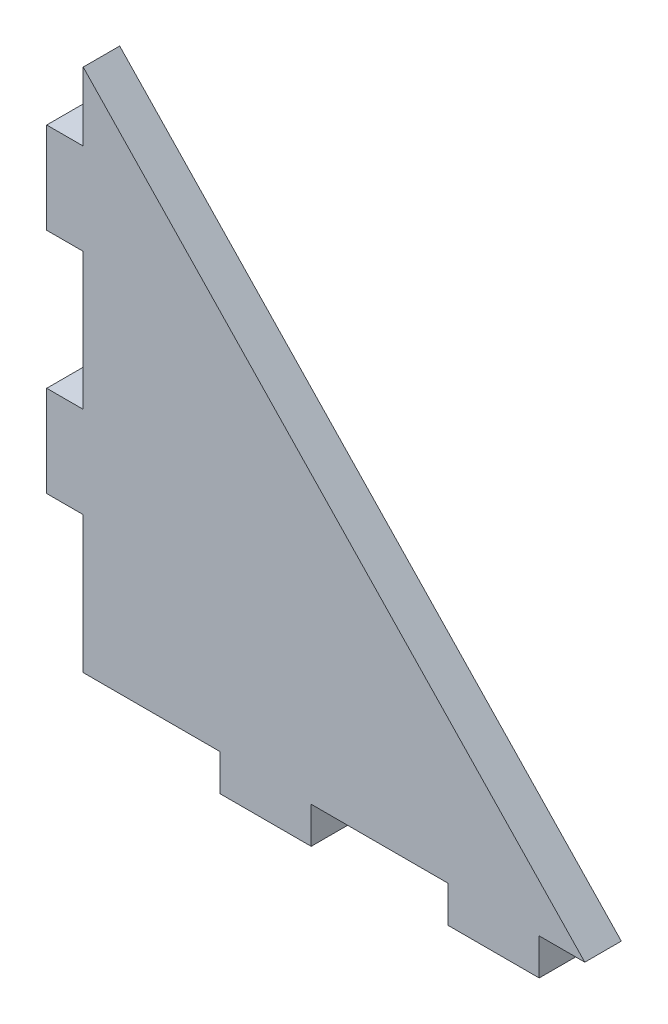
ISO-10303-21;
HEADER;
FILE_DESCRIPTION(('STEP AP214'),'2;1');
FILE_NAME('part.step','',(''),(''),'','','');
FILE_SCHEMA(('AUTOMOTIVE_DESIGN { 1 0 10303 214 1 1 1 1 }'));
ENDSEC;
DATA;
#1=APPLICATION_CONTEXT('core data for automotive mechanical design processes');
#2=APPLICATION_PROTOCOL_DEFINITION('international standard','automotive_design',2000,#1);
#3=PRODUCT_CONTEXT('',#1,'mechanical');
#4=PRODUCT('Part','Part','',(#3));
#5=PRODUCT_RELATED_PRODUCT_CATEGORY('part','',(#4));
#6=PRODUCT_DEFINITION_FORMATION('','',#4);
#7=PRODUCT_DEFINITION_CONTEXT('part definition',#1,'design');
#8=PRODUCT_DEFINITION('design','',#6,#7);
#9=PRODUCT_DEFINITION_SHAPE('','',#8);
#10=(LENGTH_UNIT() NAMED_UNIT(*) SI_UNIT(.MILLI.,.METRE.));
#11=(NAMED_UNIT(*) PLANE_ANGLE_UNIT() SI_UNIT($,.RADIAN.));
#12=(NAMED_UNIT(*) SI_UNIT($,.STERADIAN.) SOLID_ANGLE_UNIT());
#13=UNCERTAINTY_MEASURE_WITH_UNIT(LENGTH_MEASURE(1.E-05),#10,'distance_accuracy_value','');
#14=(GEOMETRIC_REPRESENTATION_CONTEXT(3) GLOBAL_UNCERTAINTY_ASSIGNED_CONTEXT((#13)) GLOBAL_UNIT_ASSIGNED_CONTEXT((#10,
#11,#12)) REPRESENTATION_CONTEXT('',''));
#15=CARTESIAN_POINT('',(0.,0.,0.));
#16=DIRECTION('',(0.,0.,1.));
#17=DIRECTION('',(1.,0.,0.));
#18=AXIS2_PLACEMENT_3D('',#15,#16,#17);
#19=CARTESIAN_POINT('',(0.,0.,8.));
#20=DIRECTION('',(0.,1.,0.));
#21=DIRECTION('',(0.,0.,1.));
#22=AXIS2_PLACEMENT_3D('',#19,#20,#21);
#23=PLANE('',#22);
#24=DIRECTION('',(0.,0.,-1.));
#25=VECTOR('',#24,1.);
#26=CARTESIAN_POINT('',(80.,0.,8.));
#27=LINE('',#26,#25);
#28=CARTESIAN_POINT('',(80.,0.,8.));
#29=VERTEX_POINT('',#28);
#30=CARTESIAN_POINT('',(80.,0.,0.));
#31=VERTEX_POINT('',#30);
#32=EDGE_CURVE('E56',#29,#31,#27,.T.);
#33=ORIENTED_EDGE('',*,*,#32,.F.);
#34=DIRECTION('',(1.,0.,0.));
#35=VECTOR('',#34,1.);
#36=CARTESIAN_POINT('',(0.,0.,8.));
#37=LINE('',#36,#35);
#38=CARTESIAN_POINT('',(50.,0.,8.));
#39=VERTEX_POINT('',#38);
#40=EDGE_CURVE('E172',#39,#29,#37,.T.);
#41=ORIENTED_EDGE('',*,*,#40,.F.);
#42=DIRECTION('',(0.,0.,-1.));
#43=VECTOR('',#42,1.);
#44=CARTESIAN_POINT('',(50.,0.,8.));
#45=LINE('',#44,#43);
#46=CARTESIAN_POINT('',(50.,0.,0.));
#47=VERTEX_POINT('',#46);
#48=EDGE_CURVE('E217',#39,#47,#45,.T.);
#49=ORIENTED_EDGE('',*,*,#48,.T.);
#50=DIRECTION('',(1.,0.,0.));
#51=VECTOR('',#50,1.);
#52=CARTESIAN_POINT('',(0.,0.,0.));
#53=LINE('',#52,#51);
#54=EDGE_CURVE('E295',#47,#31,#53,.T.);
#55=ORIENTED_EDGE('',*,*,#54,.T.);
#56=EDGE_LOOP('',(#33,#41,#49,#55));
#57=FACE_BOUND('',#56,.T.);
#58=ADVANCED_FACE('F33',(#57),#23,.F.);
#59=DIRECTION('',(0.,0.,-1.));
#60=VECTOR('',#59,1.);
#61=CARTESIAN_POINT('',(100.,0.,8.));
#62=LINE('',#61,#60);
#63=CARTESIAN_POINT('',(100.,0.,8.));
#64=VERTEX_POINT('',#63);
#65=CARTESIAN_POINT('',(100.,0.,0.));
#66=VERTEX_POINT('',#65);
#67=EDGE_CURVE('E190',#64,#66,#62,.T.);
#68=ORIENTED_EDGE('',*,*,#67,.T.);
#69=CARTESIAN_POINT('',(110.,0.,0.));
#70=VERTEX_POINT('',#69);
#71=EDGE_CURVE('E289',#66,#70,#53,.T.);
#72=ORIENTED_EDGE('',*,*,#71,.T.);
#73=DIRECTION('',(0.,0.,-1.));
#74=VECTOR('',#73,1.);
#75=CARTESIAN_POINT('',(110.,0.,8.));
#76=LINE('',#75,#74);
#77=CARTESIAN_POINT('',(110.,0.,8.));
#78=VERTEX_POINT('',#77);
#79=EDGE_CURVE('E41',#78,#70,#76,.T.);
#80=ORIENTED_EDGE('',*,*,#79,.F.);
#81=EDGE_CURVE('E48',#64,#78,#37,.T.);
#82=ORIENTED_EDGE('',*,*,#81,.F.);
#83=EDGE_LOOP('',(#68,#72,#80,#82));
#84=FACE_BOUND('',#83,.T.);
#85=ADVANCED_FACE('F322',(#84),#23,.F.);
#86=DIRECTION('',(0.,0.,-1.));
#87=VECTOR('',#86,1.);
#88=CARTESIAN_POINT('',(30.,0.,8.));
#89=LINE('',#88,#87);
#90=CARTESIAN_POINT('',(30.,0.,8.));
#91=VERTEX_POINT('',#90);
#92=CARTESIAN_POINT('',(30.,0.,0.));
#93=VERTEX_POINT('',#92);
#94=EDGE_CURVE('E210',#91,#93,#89,.T.);
#95=ORIENTED_EDGE('',*,*,#94,.F.);
#96=CARTESIAN_POINT('',(0.,0.,8.));
#97=VERTEX_POINT('',#96);
#98=EDGE_CURVE('E281',#97,#91,#37,.T.);
#99=ORIENTED_EDGE('',*,*,#98,.F.);
#100=DIRECTION('',(0.,0.,-1.));
#101=VECTOR('',#100,1.);
#102=CARTESIAN_POINT('',(0.,0.,8.));
#103=LINE('',#102,#101);
#104=CARTESIAN_POINT('',(0.,0.,0.));
#105=VERTEX_POINT('',#104);
#106=EDGE_CURVE('E11',#97,#105,#103,.T.);
#107=ORIENTED_EDGE('',*,*,#106,.T.);
#108=EDGE_CURVE('E291',#105,#93,#53,.T.);
#109=ORIENTED_EDGE('',*,*,#108,.T.);
#110=EDGE_LOOP('',(#95,#99,#107,#109));
#111=FACE_BOUND('',#110,.T.);
#112=ADVANCED_FACE('F340',(#111),#23,.F.);
#113=CARTESIAN_POINT('',(0.,0.,8.));
#114=DIRECTION('',(1.,0.,0.));
#115=DIRECTION('',(0.,0.,-1.));
#116=AXIS2_PLACEMENT_3D('',#113,#114,#115);
#117=PLANE('',#116);
#118=DIRECTION('',(0.,0.,-1.));
#119=VECTOR('',#118,1.);
#120=CARTESIAN_POINT('',(0.,80.,8.));
#121=LINE('',#120,#119);
#122=CARTESIAN_POINT('',(0.,80.,8.));
#123=VERTEX_POINT('',#122);
#124=CARTESIAN_POINT('',(0.,80.,0.));
#125=VERTEX_POINT('',#124);
#126=EDGE_CURVE('E249',#123,#125,#121,.T.);
#127=ORIENTED_EDGE('',*,*,#126,.T.);
#128=DIRECTION('',(0.,-1.,0.));
#129=VECTOR('',#128,1.);
#130=CARTESIAN_POINT('',(0.,0.,0.));
#131=LINE('',#130,#129);
#132=CARTESIAN_POINT('',(0.,50.,0.));
#133=VERTEX_POINT('',#132);
#134=EDGE_CURVE('E290',#125,#133,#131,.T.);
#135=ORIENTED_EDGE('',*,*,#134,.T.);
#136=DIRECTION('',(0.,0.,-1.));
#137=VECTOR('',#136,1.);
#138=CARTESIAN_POINT('',(0.,50.,8.));
#139=LINE('',#138,#137);
#140=CARTESIAN_POINT('',(0.,50.,8.));
#141=VERTEX_POINT('',#140);
#142=EDGE_CURVE('E273',#141,#133,#139,.T.);
#143=ORIENTED_EDGE('',*,*,#142,.F.);
#144=DIRECTION('',(0.,-1.,0.));
#145=VECTOR('',#144,1.);
#146=CARTESIAN_POINT('',(0.,0.,8.));
#147=LINE('',#146,#145);
#148=EDGE_CURVE('E279',#123,#141,#147,.T.);
#149=ORIENTED_EDGE('',*,*,#148,.F.);
#150=EDGE_LOOP('',(#127,#135,#143,#149));
#151=FACE_BOUND('',#150,.T.);
#152=ADVANCED_FACE('F350',(#151),#117,.F.);
#153=DIRECTION('',(0.,0.,-1.));
#154=VECTOR('',#153,1.);
#155=CARTESIAN_POINT('',(0.,100.,8.));
#156=LINE('',#155,#154);
#157=CARTESIAN_POINT('',(0.,100.,8.));
#158=VERTEX_POINT('',#157);
#159=CARTESIAN_POINT('',(0.,100.,0.));
#160=VERTEX_POINT('',#159);
#161=EDGE_CURVE('E246',#158,#160,#156,.T.);
#162=ORIENTED_EDGE('',*,*,#161,.F.);
#163=CARTESIAN_POINT('',(0.,115.,8.));
#164=VERTEX_POINT('',#163);
#165=EDGE_CURVE('E277',#164,#158,#147,.T.);
#166=ORIENTED_EDGE('',*,*,#165,.F.);
#167=DIRECTION('',(0.,0.,-1.));
#168=VECTOR('',#167,1.);
#169=CARTESIAN_POINT('',(0.,115.,8.));
#170=LINE('',#169,#168);
#171=CARTESIAN_POINT('',(0.,115.,0.));
#172=VERTEX_POINT('',#171);
#173=EDGE_CURVE('E286',#164,#172,#170,.T.);
#174=ORIENTED_EDGE('',*,*,#173,.T.);
#175=EDGE_CURVE('E287',#172,#160,#131,.T.);
#176=ORIENTED_EDGE('',*,*,#175,.T.);
#177=EDGE_LOOP('',(#162,#166,#174,#176));
#178=FACE_BOUND('',#177,.T.);
#179=ADVANCED_FACE('F311',(#178),#117,.F.);
#180=CARTESIAN_POINT('',(0.,30.,8.));
#181=VERTEX_POINT('',#180);
#182=EDGE_CURVE('E280',#181,#97,#147,.T.);
#183=ORIENTED_EDGE('',*,*,#182,.F.);
#184=DIRECTION('',(0.,0.,-1.));
#185=VECTOR('',#184,1.);
#186=CARTESIAN_POINT('',(0.,30.,8.));
#187=LINE('',#186,#185);
#188=CARTESIAN_POINT('',(0.,30.,0.));
#189=VERTEX_POINT('',#188);
#190=EDGE_CURVE('E260',#181,#189,#187,.T.);
#191=ORIENTED_EDGE('',*,*,#190,.T.);
#192=EDGE_CURVE('E276',#189,#105,#131,.T.);
#193=ORIENTED_EDGE('',*,*,#192,.T.);
#194=ORIENTED_EDGE('',*,*,#106,.F.);
#195=EDGE_LOOP('',(#183,#191,#193,#194));
#196=FACE_BOUND('',#195,.T.);
#197=ADVANCED_FACE('F35',(#196),#117,.F.);
#198=CARTESIAN_POINT('',(0.,115.,8.));
#199=DIRECTION('',(-0.722641857147699,-0.691222645967364,0.));
#200=DIRECTION('',(0.691222645967364,-0.722641857147699,0.));
#201=AXIS2_PLACEMENT_3D('',#198,#199,#200);
#202=PLANE('',#201);
#203=DIRECTION('',(-0.691222645967364,0.722641857147699,0.));
#204=VECTOR('',#203,1.);
#205=CARTESIAN_POINT('',(0.,115.,0.));
#206=LINE('',#205,#204);
#207=EDGE_CURVE('E294',#70,#172,#206,.T.);
#208=ORIENTED_EDGE('',*,*,#207,.T.);
#209=ORIENTED_EDGE('',*,*,#173,.F.);
#210=DIRECTION('',(-0.691222645967364,0.722641857147699,0.));
#211=VECTOR('',#210,1.);
#212=CARTESIAN_POINT('',(0.,115.,8.));
#213=LINE('',#212,#211);
#214=EDGE_CURVE('E284',#78,#164,#213,.T.);
#215=ORIENTED_EDGE('',*,*,#214,.F.);
#216=ORIENTED_EDGE('',*,*,#79,.T.);
#217=EDGE_LOOP('',(#208,#209,#215,#216));
#218=FACE_BOUND('',#217,.T.);
#219=ADVANCED_FACE('F302',(#218),#202,.F.);
#220=CARTESIAN_POINT('',(0.,0.,8.));
#221=DIRECTION('',(0.,0.,-1.));
#222=DIRECTION('',(-1.,0.,0.));
#223=AXIS2_PLACEMENT_3D('',#220,#221,#222);
#224=PLANE('',#223);
#225=ORIENTED_EDGE('',*,*,#165,.T.);
#226=DIRECTION('',(-1.,0.,0.));
#227=VECTOR('',#226,1.);
#228=CARTESIAN_POINT('',(0.,100.,8.));
#229=LINE('',#228,#227);
#230=CARTESIAN_POINT('',(-8.,100.,8.));
#231=VERTEX_POINT('',#230);
#232=EDGE_CURVE('E230',#158,#231,#229,.T.);
#233=ORIENTED_EDGE('',*,*,#232,.T.);
#234=DIRECTION('',(0.,-1.,0.));
#235=VECTOR('',#234,1.);
#236=CARTESIAN_POINT('',(-8.,80.,8.));
#237=LINE('',#236,#235);
#238=CARTESIAN_POINT('',(-8.,80.,8.));
#239=VERTEX_POINT('',#238);
#240=EDGE_CURVE('E233',#231,#239,#237,.T.);
#241=ORIENTED_EDGE('',*,*,#240,.T.);
#242=DIRECTION('',(1.,0.,0.));
#243=VECTOR('',#242,1.);
#244=CARTESIAN_POINT('',(0.,80.,8.));
#245=LINE('',#244,#243);
#246=EDGE_CURVE('E227',#239,#123,#245,.T.);
#247=ORIENTED_EDGE('',*,*,#246,.T.);
#248=ORIENTED_EDGE('',*,*,#148,.T.);
#249=DIRECTION('',(-1.,0.,0.));
#250=VECTOR('',#249,1.);
#251=CARTESIAN_POINT('',(0.,50.,8.));
#252=LINE('',#251,#250);
#253=CARTESIAN_POINT('',(-8.,50.,8.));
#254=VERTEX_POINT('',#253);
#255=EDGE_CURVE('E253',#141,#254,#252,.T.);
#256=ORIENTED_EDGE('',*,*,#255,.T.);
#257=DIRECTION('',(0.,-1.,0.));
#258=VECTOR('',#257,1.);
#259=CARTESIAN_POINT('',(-8.,30.,8.));
#260=LINE('',#259,#258);
#261=CARTESIAN_POINT('',(-8.,30.,8.));
#262=VERTEX_POINT('',#261);
#263=EDGE_CURVE('E255',#254,#262,#260,.T.);
#264=ORIENTED_EDGE('',*,*,#263,.T.);
#265=DIRECTION('',(1.,0.,0.));
#266=VECTOR('',#265,1.);
#267=CARTESIAN_POINT('',(0.,30.,8.));
#268=LINE('',#267,#266);
#269=EDGE_CURVE('E258',#262,#181,#268,.T.);
#270=ORIENTED_EDGE('',*,*,#269,.T.);
#271=ORIENTED_EDGE('',*,*,#182,.T.);
#272=ORIENTED_EDGE('',*,*,#98,.T.);
#273=DIRECTION('',(0.,-1.,0.));
#274=VECTOR('',#273,1.);
#275=CARTESIAN_POINT('',(30.,0.,8.));
#276=LINE('',#275,#274);
#277=CARTESIAN_POINT('',(30.,-8.,8.));
#278=VERTEX_POINT('',#277);
#279=EDGE_CURVE('E202',#91,#278,#276,.T.);
#280=ORIENTED_EDGE('',*,*,#279,.T.);
#281=DIRECTION('',(1.,0.,0.));
#282=VECTOR('',#281,1.);
#283=CARTESIAN_POINT('',(30.,-8.,8.));
#284=LINE('',#283,#282);
#285=CARTESIAN_POINT('',(50.,-8.,8.));
#286=VERTEX_POINT('',#285);
#287=EDGE_CURVE('E205',#278,#286,#284,.T.);
#288=ORIENTED_EDGE('',*,*,#287,.T.);
#289=DIRECTION('',(0.,1.,0.));
#290=VECTOR('',#289,1.);
#291=CARTESIAN_POINT('',(50.,0.,8.));
#292=LINE('',#291,#290);
#293=EDGE_CURVE('E208',#286,#39,#292,.T.);
#294=ORIENTED_EDGE('',*,*,#293,.T.);
#295=ORIENTED_EDGE('',*,*,#40,.T.);
#296=DIRECTION('',(0.,-1.,0.));
#297=VECTOR('',#296,1.);
#298=CARTESIAN_POINT('',(80.,0.,8.));
#299=LINE('',#298,#297);
#300=CARTESIAN_POINT('',(80.,-8.,8.));
#301=VERTEX_POINT('',#300);
#302=EDGE_CURVE('E165',#29,#301,#299,.T.);
#303=ORIENTED_EDGE('',*,*,#302,.T.);
#304=DIRECTION('',(1.,0.,0.));
#305=VECTOR('',#304,1.);
#306=CARTESIAN_POINT('',(80.,-8.,8.));
#307=LINE('',#306,#305);
#308=CARTESIAN_POINT('',(100.,-8.,8.));
#309=VERTEX_POINT('',#308);
#310=EDGE_CURVE('E170',#301,#309,#307,.T.);
#311=ORIENTED_EDGE('',*,*,#310,.T.);
#312=DIRECTION('',(0.,1.,0.));
#313=VECTOR('',#312,1.);
#314=CARTESIAN_POINT('',(100.,0.,8.));
#315=LINE('',#314,#313);
#316=EDGE_CURVE('E188',#309,#64,#315,.T.);
#317=ORIENTED_EDGE('',*,*,#316,.T.);
#318=ORIENTED_EDGE('',*,*,#81,.T.);
#319=ORIENTED_EDGE('',*,*,#214,.T.);
#320=EDGE_LOOP('',(#225,#233,#241,#247,#248,#256,#264,#270,#271,#272,#280,#288,#294,#295,#303,
#311,#317,#318,#319));
#321=FACE_BOUND('',#320,.T.);
#322=ADVANCED_FACE('F168',(#321),#224,.F.);
#323=CARTESIAN_POINT('',(0.,0.,0.));
#324=DIRECTION('',(0.,0.,-1.));
#325=DIRECTION('',(-1.,0.,0.));
#326=AXIS2_PLACEMENT_3D('',#323,#324,#325);
#327=PLANE('',#326);
#328=ORIENTED_EDGE('',*,*,#175,.F.);
#329=ORIENTED_EDGE('',*,*,#207,.F.);
#330=ORIENTED_EDGE('',*,*,#71,.F.);
#331=DIRECTION('',(0.,1.,0.));
#332=VECTOR('',#331,1.);
#333=CARTESIAN_POINT('',(100.,0.,0.));
#334=LINE('',#333,#332);
#335=CARTESIAN_POINT('',(100.,-8.,0.));
#336=VERTEX_POINT('',#335);
#337=EDGE_CURVE('E174',#336,#66,#334,.T.);
#338=ORIENTED_EDGE('',*,*,#337,.F.);
#339=DIRECTION('',(1.,0.,0.));
#340=VECTOR('',#339,1.);
#341=CARTESIAN_POINT('',(80.,-8.,0.));
#342=LINE('',#341,#340);
#343=CARTESIAN_POINT('',(80.,-8.,0.));
#344=VERTEX_POINT('',#343);
#345=EDGE_CURVE('E194',#344,#336,#342,.T.);
#346=ORIENTED_EDGE('',*,*,#345,.F.);
#347=DIRECTION('',(0.,-1.,0.));
#348=VECTOR('',#347,1.);
#349=CARTESIAN_POINT('',(80.,0.,0.));
#350=LINE('',#349,#348);
#351=EDGE_CURVE('E180',#31,#344,#350,.T.);
#352=ORIENTED_EDGE('',*,*,#351,.F.);
#353=ORIENTED_EDGE('',*,*,#54,.F.);
#354=DIRECTION('',(0.,1.,0.));
#355=VECTOR('',#354,1.);
#356=CARTESIAN_POINT('',(50.,0.,0.));
#357=LINE('',#356,#355);
#358=CARTESIAN_POINT('',(50.,-8.,0.));
#359=VERTEX_POINT('',#358);
#360=EDGE_CURVE('E206',#359,#47,#357,.T.);
#361=ORIENTED_EDGE('',*,*,#360,.F.);
#362=DIRECTION('',(1.,0.,0.));
#363=VECTOR('',#362,1.);
#364=CARTESIAN_POINT('',(30.,-8.,0.));
#365=LINE('',#364,#363);
#366=CARTESIAN_POINT('',(30.,-8.,0.));
#367=VERTEX_POINT('',#366);
#368=EDGE_CURVE('E213',#367,#359,#365,.T.);
#369=ORIENTED_EDGE('',*,*,#368,.F.);
#370=DIRECTION('',(0.,-1.,0.));
#371=VECTOR('',#370,1.);
#372=CARTESIAN_POINT('',(30.,0.,0.));
#373=LINE('',#372,#371);
#374=EDGE_CURVE('E201',#93,#367,#373,.T.);
#375=ORIENTED_EDGE('',*,*,#374,.F.);
#376=ORIENTED_EDGE('',*,*,#108,.F.);
#377=ORIENTED_EDGE('',*,*,#192,.F.);
#378=DIRECTION('',(1.,0.,0.));
#379=VECTOR('',#378,1.);
#380=CARTESIAN_POINT('',(0.,30.,0.));
#381=LINE('',#380,#379);
#382=CARTESIAN_POINT('',(-8.,30.,0.));
#383=VERTEX_POINT('',#382);
#384=EDGE_CURVE('E256',#383,#189,#381,.T.);
#385=ORIENTED_EDGE('',*,*,#384,.F.);
#386=DIRECTION('',(0.,-1.,0.));
#387=VECTOR('',#386,1.);
#388=CARTESIAN_POINT('',(-8.,30.,0.));
#389=LINE('',#388,#387);
#390=CARTESIAN_POINT('',(-8.,50.,0.));
#391=VERTEX_POINT('',#390);
#392=EDGE_CURVE('E262',#391,#383,#389,.T.);
#393=ORIENTED_EDGE('',*,*,#392,.F.);
#394=DIRECTION('',(-1.,0.,0.));
#395=VECTOR('',#394,1.);
#396=CARTESIAN_POINT('',(0.,50.,0.));
#397=LINE('',#396,#395);
#398=EDGE_CURVE('E252',#133,#391,#397,.T.);
#399=ORIENTED_EDGE('',*,*,#398,.F.);
#400=ORIENTED_EDGE('',*,*,#134,.F.);
#401=DIRECTION('',(1.,0.,0.));
#402=VECTOR('',#401,1.);
#403=CARTESIAN_POINT('',(0.,80.,0.));
#404=LINE('',#403,#402);
#405=CARTESIAN_POINT('',(-8.,80.,0.));
#406=VERTEX_POINT('',#405);
#407=EDGE_CURVE('E226',#406,#125,#404,.T.);
#408=ORIENTED_EDGE('',*,*,#407,.F.);
#409=DIRECTION('',(0.,-1.,0.));
#410=VECTOR('',#409,1.);
#411=CARTESIAN_POINT('',(-8.,80.,0.));
#412=LINE('',#411,#410);
#413=CARTESIAN_POINT('',(-8.,100.,0.));
#414=VERTEX_POINT('',#413);
#415=EDGE_CURVE('E231',#414,#406,#412,.T.);
#416=ORIENTED_EDGE('',*,*,#415,.F.);
#417=DIRECTION('',(-1.,0.,0.));
#418=VECTOR('',#417,1.);
#419=CARTESIAN_POINT('',(0.,100.,0.));
#420=LINE('',#419,#418);
#421=EDGE_CURVE('E238',#160,#414,#420,.T.);
#422=ORIENTED_EDGE('',*,*,#421,.F.);
#423=EDGE_LOOP('',(#328,#329,#330,#338,#346,#352,#353,#361,#369,#375,#376,#377,#385,#393,#399,
#400,#408,#416,#422));
#424=FACE_BOUND('',#423,.T.);
#425=ADVANCED_FACE('F306',(#424),#327,.T.);
#426=CARTESIAN_POINT('',(0.,50.,8.));
#427=DIRECTION('',(0.,-1.,0.));
#428=DIRECTION('',(0.,0.,-1.));
#429=AXIS2_PLACEMENT_3D('',#426,#427,#428);
#430=PLANE('',#429);
#431=ORIENTED_EDGE('',*,*,#398,.T.);
#432=DIRECTION('',(0.,0.,-1.));
#433=VECTOR('',#432,1.);
#434=CARTESIAN_POINT('',(-8.,50.,8.));
#435=LINE('',#434,#433);
#436=EDGE_CURVE('E270',#254,#391,#435,.T.);
#437=ORIENTED_EDGE('',*,*,#436,.F.);
#438=ORIENTED_EDGE('',*,*,#255,.F.);
#439=ORIENTED_EDGE('',*,*,#142,.T.);
#440=EDGE_LOOP('',(#431,#437,#438,#439));
#441=FACE_BOUND('',#440,.T.);
#442=ADVANCED_FACE('F357',(#441),#430,.F.);
#443=CARTESIAN_POINT('',(-8.,30.,8.));
#444=DIRECTION('',(1.,0.,0.));
#445=DIRECTION('',(0.,0.,-1.));
#446=AXIS2_PLACEMENT_3D('',#443,#444,#445);
#447=PLANE('',#446);
#448=ORIENTED_EDGE('',*,*,#392,.T.);
#449=DIRECTION('',(0.,0.,-1.));
#450=VECTOR('',#449,1.);
#451=CARTESIAN_POINT('',(-8.,30.,8.));
#452=LINE('',#451,#450);
#453=EDGE_CURVE('E267',#262,#383,#452,.T.);
#454=ORIENTED_EDGE('',*,*,#453,.F.);
#455=ORIENTED_EDGE('',*,*,#263,.F.);
#456=ORIENTED_EDGE('',*,*,#436,.T.);
#457=EDGE_LOOP('',(#448,#454,#455,#456));
#458=FACE_BOUND('',#457,.T.);
#459=ADVANCED_FACE('F365',(#458),#447,.F.);
#460=CARTESIAN_POINT('',(0.,30.,8.));
#461=DIRECTION('',(0.,1.,0.));
#462=DIRECTION('',(-1.,0.,0.));
#463=AXIS2_PLACEMENT_3D('',#460,#461,#462);
#464=PLANE('',#463);
#465=ORIENTED_EDGE('',*,*,#384,.T.);
#466=ORIENTED_EDGE('',*,*,#190,.F.);
#467=ORIENTED_EDGE('',*,*,#269,.F.);
#468=ORIENTED_EDGE('',*,*,#453,.T.);
#469=EDGE_LOOP('',(#465,#466,#467,#468));
#470=FACE_BOUND('',#469,.T.);
#471=ADVANCED_FACE('F363',(#470),#464,.F.);
#472=CARTESIAN_POINT('',(0.,80.,8.));
#473=DIRECTION('',(0.,1.,0.));
#474=DIRECTION('',(0.,0.,1.));
#475=AXIS2_PLACEMENT_3D('',#472,#473,#474);
#476=PLANE('',#475);
#477=ORIENTED_EDGE('',*,*,#407,.T.);
#478=ORIENTED_EDGE('',*,*,#126,.F.);
#479=ORIENTED_EDGE('',*,*,#246,.F.);
#480=DIRECTION('',(0.,0.,-1.));
#481=VECTOR('',#480,1.);
#482=CARTESIAN_POINT('',(-8.,80.,8.));
#483=LINE('',#482,#481);
#484=EDGE_CURVE('E235',#239,#406,#483,.T.);
#485=ORIENTED_EDGE('',*,*,#484,.T.);
#486=EDGE_LOOP('',(#477,#478,#479,#485));
#487=FACE_BOUND('',#486,.T.);
#488=ADVANCED_FACE('F372',(#487),#476,.F.);
#489=CARTESIAN_POINT('',(0.,100.,8.));
#490=DIRECTION('',(0.,-1.,0.));
#491=DIRECTION('',(0.,0.,-1.));
#492=AXIS2_PLACEMENT_3D('',#489,#490,#491);
#493=PLANE('',#492);
#494=ORIENTED_EDGE('',*,*,#421,.T.);
#495=DIRECTION('',(0.,0.,-1.));
#496=VECTOR('',#495,1.);
#497=CARTESIAN_POINT('',(-8.,100.,8.));
#498=LINE('',#497,#496);
#499=EDGE_CURVE('E243',#231,#414,#498,.T.);
#500=ORIENTED_EDGE('',*,*,#499,.F.);
#501=ORIENTED_EDGE('',*,*,#232,.F.);
#502=ORIENTED_EDGE('',*,*,#161,.T.);
#503=EDGE_LOOP('',(#494,#500,#501,#502));
#504=FACE_BOUND('',#503,.T.);
#505=ADVANCED_FACE('F315',(#504),#493,.F.);
#506=CARTESIAN_POINT('',(-8.,80.,8.));
#507=DIRECTION('',(1.,0.,0.));
#508=DIRECTION('',(0.,0.,-1.));
#509=AXIS2_PLACEMENT_3D('',#506,#507,#508);
#510=PLANE('',#509);
#511=ORIENTED_EDGE('',*,*,#415,.T.);
#512=ORIENTED_EDGE('',*,*,#484,.F.);
#513=ORIENTED_EDGE('',*,*,#240,.F.);
#514=ORIENTED_EDGE('',*,*,#499,.T.);
#515=EDGE_LOOP('',(#511,#512,#513,#514));
#516=FACE_BOUND('',#515,.T.);
#517=ADVANCED_FACE('F438',(#516),#510,.F.);
#518=CARTESIAN_POINT('',(30.,0.,8.));
#519=DIRECTION('',(1.,0.,0.));
#520=DIRECTION('',(0.,0.,-1.));
#521=AXIS2_PLACEMENT_3D('',#518,#519,#520);
#522=PLANE('',#521);
#523=ORIENTED_EDGE('',*,*,#374,.T.);
#524=DIRECTION('',(0.,0.,-1.));
#525=VECTOR('',#524,1.);
#526=CARTESIAN_POINT('',(30.,-8.,8.));
#527=LINE('',#526,#525);
#528=EDGE_CURVE('E223',#278,#367,#527,.T.);
#529=ORIENTED_EDGE('',*,*,#528,.F.);
#530=ORIENTED_EDGE('',*,*,#279,.F.);
#531=ORIENTED_EDGE('',*,*,#94,.T.);
#532=EDGE_LOOP('',(#523,#529,#530,#531));
#533=FACE_BOUND('',#532,.T.);
#534=ADVANCED_FACE('F335',(#533),#522,.F.);
#535=CARTESIAN_POINT('',(30.,-8.,8.));
#536=DIRECTION('',(0.,1.,0.));
#537=DIRECTION('',(0.,0.,1.));
#538=AXIS2_PLACEMENT_3D('',#535,#536,#537);
#539=PLANE('',#538);
#540=ORIENTED_EDGE('',*,*,#368,.T.);
#541=DIRECTION('',(0.,0.,-1.));
#542=VECTOR('',#541,1.);
#543=CARTESIAN_POINT('',(50.,-8.,8.));
#544=LINE('',#543,#542);
#545=EDGE_CURVE('E220',#286,#359,#544,.T.);
#546=ORIENTED_EDGE('',*,*,#545,.F.);
#547=ORIENTED_EDGE('',*,*,#287,.F.);
#548=ORIENTED_EDGE('',*,*,#528,.T.);
#549=EDGE_LOOP('',(#540,#546,#547,#548));
#550=FACE_BOUND('',#549,.T.);
#551=ADVANCED_FACE('F332',(#550),#539,.F.);
#552=CARTESIAN_POINT('',(50.,0.,8.));
#553=DIRECTION('',(-1.,0.,0.));
#554=DIRECTION('',(0.,0.,1.));
#555=AXIS2_PLACEMENT_3D('',#552,#553,#554);
#556=PLANE('',#555);
#557=ORIENTED_EDGE('',*,*,#360,.T.);
#558=ORIENTED_EDGE('',*,*,#48,.F.);
#559=ORIENTED_EDGE('',*,*,#293,.F.);
#560=ORIENTED_EDGE('',*,*,#545,.T.);
#561=EDGE_LOOP('',(#557,#558,#559,#560));
#562=FACE_BOUND('',#561,.T.);
#563=ADVANCED_FACE('F328',(#562),#556,.F.);
#564=CARTESIAN_POINT('',(80.,0.,8.));
#565=DIRECTION('',(1.,0.,0.));
#566=DIRECTION('',(0.,0.,-1.));
#567=AXIS2_PLACEMENT_3D('',#564,#565,#566);
#568=PLANE('',#567);
#569=ORIENTED_EDGE('',*,*,#351,.T.);
#570=DIRECTION('',(0.,0.,-1.));
#571=VECTOR('',#570,1.);
#572=CARTESIAN_POINT('',(80.,-8.,8.));
#573=LINE('',#572,#571);
#574=EDGE_CURVE('E177',#301,#344,#573,.T.);
#575=ORIENTED_EDGE('',*,*,#574,.F.);
#576=ORIENTED_EDGE('',*,*,#302,.F.);
#577=ORIENTED_EDGE('',*,*,#32,.T.);
#578=EDGE_LOOP('',(#569,#575,#576,#577));
#579=FACE_BOUND('',#578,.T.);
#580=ADVANCED_FACE('F178',(#579),#568,.F.);
#581=CARTESIAN_POINT('',(80.,-8.,8.));
#582=DIRECTION('',(0.,1.,0.));
#583=DIRECTION('',(0.,0.,1.));
#584=AXIS2_PLACEMENT_3D('',#581,#582,#583);
#585=PLANE('',#584);
#586=ORIENTED_EDGE('',*,*,#345,.T.);
#587=DIRECTION('',(0.,0.,-1.));
#588=VECTOR('',#587,1.);
#589=CARTESIAN_POINT('',(100.,-8.,8.));
#590=LINE('',#589,#588);
#591=EDGE_CURVE('E183',#309,#336,#590,.T.);
#592=ORIENTED_EDGE('',*,*,#591,.F.);
#593=ORIENTED_EDGE('',*,*,#310,.F.);
#594=ORIENTED_EDGE('',*,*,#574,.T.);
#595=EDGE_LOOP('',(#586,#592,#593,#594));
#596=FACE_BOUND('',#595,.T.);
#597=ADVANCED_FACE('F185',(#596),#585,.F.);
#598=CARTESIAN_POINT('',(100.,0.,8.));
#599=DIRECTION('',(-1.,0.,0.));
#600=DIRECTION('',(0.,0.,1.));
#601=AXIS2_PLACEMENT_3D('',#598,#599,#600);
#602=PLANE('',#601);
#603=ORIENTED_EDGE('',*,*,#337,.T.);
#604=ORIENTED_EDGE('',*,*,#67,.F.);
#605=ORIENTED_EDGE('',*,*,#316,.F.);
#606=ORIENTED_EDGE('',*,*,#591,.T.);
#607=EDGE_LOOP('',(#603,#604,#605,#606));
#608=FACE_BOUND('',#607,.T.);
#609=ADVANCED_FACE('F321',(#608),#602,.F.);
#610=CLOSED_SHELL('',(#58,#85,#112,#152,#179,#197,#219,#322,#425,#442,#459,#471,#488,#505,#517,
#534,#551,#563,#580,#597,#609));
#611=MANIFOLD_SOLID_BREP('B2',#610);
#612=ADVANCED_BREP_SHAPE_REPRESENTATION('',(#18,#611),#14);
#613=SHAPE_DEFINITION_REPRESENTATION(#9,#612);
ENDSEC;
END-ISO-10303-21;
